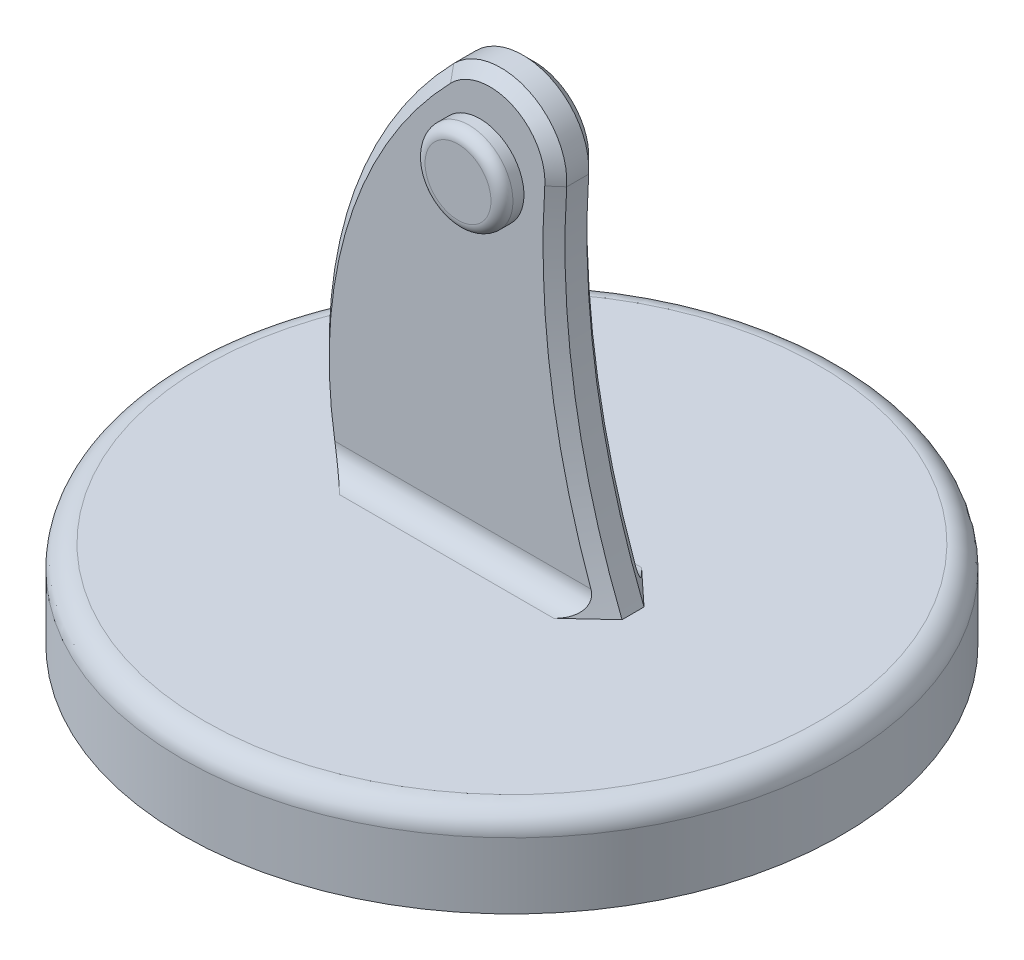
ISO-10303-21;
HEADER;
FILE_DESCRIPTION(('STEP AP214'),'2;1');
FILE_NAME('part.step','',(''),(''),'','','');
FILE_SCHEMA(('AUTOMOTIVE_DESIGN { 1 0 10303 214 1 1 1 1 }'));
ENDSEC;
DATA;
#1=APPLICATION_CONTEXT('core data for automotive mechanical design processes');
#2=APPLICATION_PROTOCOL_DEFINITION('international standard','automotive_design',2000,#1);
#3=PRODUCT_CONTEXT('',#1,'mechanical');
#4=PRODUCT('Part','Part','',(#3));
#5=PRODUCT_RELATED_PRODUCT_CATEGORY('part','',(#4));
#6=PRODUCT_DEFINITION_FORMATION('','',#4);
#7=PRODUCT_DEFINITION_CONTEXT('part definition',#1,'design');
#8=PRODUCT_DEFINITION('design','',#6,#7);
#9=PRODUCT_DEFINITION_SHAPE('','',#8);
#10=(LENGTH_UNIT() NAMED_UNIT(*) SI_UNIT(.MILLI.,.METRE.));
#11=(NAMED_UNIT(*) PLANE_ANGLE_UNIT() SI_UNIT($,.RADIAN.));
#12=(NAMED_UNIT(*) SI_UNIT($,.STERADIAN.) SOLID_ANGLE_UNIT());
#13=UNCERTAINTY_MEASURE_WITH_UNIT(LENGTH_MEASURE(1.E-05),#10,'distance_accuracy_value','');
#14=(GEOMETRIC_REPRESENTATION_CONTEXT(3) GLOBAL_UNCERTAINTY_ASSIGNED_CONTEXT((#13)) GLOBAL_UNIT_ASSIGNED_CONTEXT((#10,
#11,#12)) REPRESENTATION_CONTEXT('',''));
#15=CARTESIAN_POINT('',(0.,0.,0.));
#16=DIRECTION('',(0.,0.,1.));
#17=DIRECTION('',(1.,0.,0.));
#18=AXIS2_PLACEMENT_3D('',#15,#16,#17);
#19=CARTESIAN_POINT('',(0.,20.,0.));
#20=DIRECTION('',(0.,1.,0.));
#21=DIRECTION('',(0.,0.,1.));
#22=AXIS2_PLACEMENT_3D('',#19,#20,#21);
#23=PLANE('',#22);
#24=CARTESIAN_POINT('',(0.,20.,0.));
#25=DIRECTION('',(0.,1.,0.));
#26=DIRECTION('',(0.,0.,1.));
#27=AXIS2_PLACEMENT_3D('',#24,#25,#26);
#28=CIRCLE('',#27,70.);
#29=CARTESIAN_POINT('',(0.,20.,70.));
#30=VERTEX_POINT('',#29);
#31=EDGE_CURVE('E390',#30,#30,#28,.T.);
#32=ORIENTED_EDGE('',*,*,#31,.T.);
#33=EDGE_LOOP('',(#32));
#34=FACE_BOUND('',#33,.T.);
#35=CARTESIAN_POINT('',(-36.9107772179394,20.,-2.50000000000001));
#36=CARTESIAN_POINT('',(-36.0587032409687,20.,-3.33357747056855));
#37=CARTESIAN_POINT('',(-35.2063974116353,20.,-4.16691801838047));
#38=CARTESIAN_POINT('',(-33.5004634846245,20.,-5.83388027654785));
#39=CARTESIAN_POINT('',(-32.6468349025053,20.,-6.66750149112744));
#40=CARTESIAN_POINT('',(-30.9390294844765,20.,-8.33418262843735));
#41=CARTESIAN_POINT('',(-30.0848526484069,20.,-9.16724255100359));
#42=CARTESIAN_POINT('',(-29.2303809474323,20.,-9.9999999999896));
#43=B_SPLINE_CURVE_WITH_KNOTS('',3,(#35,#36,#37,#38,#39,#40,#41,#42),.UNSPECIFIED.,.F.,.F.,(4,2,
2,4),(0.,3.5760220109257,7.15547071970092,10.7349204744513),.UNSPECIFIED.);
#44=CARTESIAN_POINT('',(-36.9107772179394,20.,-2.50000000000001));
#45=VERTEX_POINT('',#44);
#46=CARTESIAN_POINT('',(-29.2303809474323,20.,-10.));
#47=VERTEX_POINT('',#46);
#48=EDGE_CURVE('E203',#45,#47,#43,.T.);
#49=ORIENTED_EDGE('',*,*,#48,.T.);
#50=DIRECTION('',(-1.,0.,0.));
#51=VECTOR('',#50,1.);
#52=CARTESIAN_POINT('',(24.8698524847124,20.,-10.));
#53=LINE('',#52,#51);
#54=CARTESIAN_POINT('',(19.5040463919247,20.,-10.));
#55=VERTEX_POINT('',#54);
#56=EDGE_CURVE('E380',#47,#55,#53,.F.);
#57=ORIENTED_EDGE('',*,*,#56,.T.);
#58=CARTESIAN_POINT('',(19.5040463919247,20.,-10.));
#59=CARTESIAN_POINT('',(20.397508234764,20.,-9.16576602034739));
#60=CARTESIAN_POINT('',(21.2913774927222,20.,-8.33196826222493));
#61=CARTESIAN_POINT('',(23.0799671670029,20.,-6.66528766783262));
#62=CARTESIAN_POINT('',(23.9746875826167,20.,-5.83240483080218));
#63=CARTESIAN_POINT('',(25.766539217704,20.,-4.16618003396809));
#64=CARTESIAN_POINT('',(26.6636719497664,20.,-3.33283970082115));
#65=CARTESIAN_POINT('',(27.56126931161,20.,-2.5));
#66=B_SPLINE_CURVE_WITH_KNOTS('',3,(#58,#59,#60,#61,#62,#63,#64,#65),.UNSPECIFIED.,.F.,.F.,(4,2,
2,4),(0.,3.66714922761795,7.33429540442286,11.0076759368626),.UNSPECIFIED.);
#67=CARTESIAN_POINT('',(27.56126931161,20.,-2.50000000000001));
#68=VERTEX_POINT('',#67);
#69=EDGE_CURVE('E195',#55,#68,#66,.T.);
#70=ORIENTED_EDGE('',*,*,#69,.T.);
#71=DIRECTION('',(0.,0.,-1.));
#72=VECTOR('',#71,1.);
#73=CARTESIAN_POINT('',(27.56126931161,20.,5.));
#74=LINE('',#73,#72);
#75=CARTESIAN_POINT('',(27.56126931161,20.,2.50000000000003));
#76=VERTEX_POINT('',#75);
#77=EDGE_CURVE('E151',#68,#76,#74,.F.);
#78=ORIENTED_EDGE('',*,*,#77,.T.);
#79=CARTESIAN_POINT('',(27.56126931161,20.,2.50000000000003));
#80=CARTESIAN_POINT('',(26.6636719497664,20.,3.33283970082116));
#81=CARTESIAN_POINT('',(25.766539217704,20.,4.16618003396809));
#82=CARTESIAN_POINT('',(23.9746875826167,20.,5.83240483080217));
#83=CARTESIAN_POINT('',(23.0799671670029,20.,6.66528766783261));
#84=CARTESIAN_POINT('',(21.2913774927222,20.,8.33196826222493));
#85=CARTESIAN_POINT('',(20.397508234764,20.,9.16576602034738));
#86=CARTESIAN_POINT('',(19.5040463919247,20.,10.));
#87=B_SPLINE_CURVE_WITH_KNOTS('',3,(#79,#80,#81,#82,#83,#84,#85,#86),.UNSPECIFIED.,.F.,.F.,(4,2,
2,4),(0.,3.6733805324397,7.34052670924461,11.0076759368626),.UNSPECIFIED.);
#88=CARTESIAN_POINT('',(19.5040463919247,20.,10.));
#89=VERTEX_POINT('',#88);
#90=EDGE_CURVE('E162',#76,#89,#87,.T.);
#91=ORIENTED_EDGE('',*,*,#90,.T.);
#92=DIRECTION('',(-1.,0.,0.));
#93=VECTOR('',#92,1.);
#94=CARTESIAN_POINT('',(0.,20.,10.));
#95=LINE('',#94,#93);
#96=CARTESIAN_POINT('',(-29.2303809474216,20.,10.));
#97=VERTEX_POINT('',#96);
#98=EDGE_CURVE('E376',#89,#97,#95,.T.);
#99=ORIENTED_EDGE('',*,*,#98,.T.);
#100=CARTESIAN_POINT('',(-29.2303809474216,20.,9.99999999999999));
#101=CARTESIAN_POINT('',(-30.084852648398,20.,9.16724255101225));
#102=CARTESIAN_POINT('',(-30.9390294844695,20.,8.33418262844429));
#103=CARTESIAN_POINT('',(-32.6468349025017,20.,6.66750149113092));
#104=CARTESIAN_POINT('',(-33.5004634846227,20.,5.83388027654959));
#105=CARTESIAN_POINT('',(-35.2063974116353,20.,4.16691801838047));
#106=CARTESIAN_POINT('',(-36.0587032409687,20.,3.33357747056856));
#107=CARTESIAN_POINT('',(-36.9107772179394,20.,2.50000000000004));
#108=B_SPLINE_CURVE_WITH_KNOTS('',3,(#100,#101,#102,#103,#104,#105,#106,#107),.UNSPECIFIED.,.F.,
.F.,(4,2,2,4),(0.,3.57944975475781,7.15889846354047,10.7349204744661),.UNSPECIFIED.);
#109=CARTESIAN_POINT('',(-36.9107772179394,20.,2.50000000000003));
#110=VERTEX_POINT('',#109);
#111=EDGE_CURVE('E170',#97,#110,#108,.T.);
#112=ORIENTED_EDGE('',*,*,#111,.T.);
#113=DIRECTION('',(0.,0.,-1.));
#114=VECTOR('',#113,1.);
#115=CARTESIAN_POINT('',(-36.9107772179394,20.,5.));
#116=LINE('',#115,#114);
#117=EDGE_CURVE('E143',#110,#45,#116,.T.);
#118=ORIENTED_EDGE('',*,*,#117,.T.);
#119=EDGE_LOOP('',(#49,#57,#70,#78,#91,#99,#112,#118));
#120=FACE_BOUND('',#119,.T.);
#121=ADVANCED_FACE('F39',(#34,#120),#23,.T.);
#122=CARTESIAN_POINT('',(0.,20.,0.));
#123=DIRECTION('',(0.,-1.,0.));
#124=DIRECTION('',(0.,0.,-1.));
#125=AXIS2_PLACEMENT_3D('',#122,#123,#124);
#126=CYLINDRICAL_SURFACE('',#125,75.);
#127=CARTESIAN_POINT('',(0.,15.,0.));
#128=DIRECTION('',(0.,1.,0.));
#129=DIRECTION('',(0.,0.,1.));
#130=AXIS2_PLACEMENT_3D('',#127,#128,#129);
#131=CIRCLE('',#130,75.);
#132=CARTESIAN_POINT('',(0.,15.,75.));
#133=VERTEX_POINT('',#132);
#134=EDGE_CURVE('E325',#133,#133,#131,.F.);
#135=ORIENTED_EDGE('',*,*,#134,.T.);
#136=EDGE_LOOP('',(#135));
#137=FACE_BOUND('',#136,.T.);
#138=CARTESIAN_POINT('',(0.,0.,0.));
#139=DIRECTION('',(0.,1.,0.));
#140=DIRECTION('',(0.,0.,1.));
#141=AXIS2_PLACEMENT_3D('',#138,#139,#140);
#142=CIRCLE('',#141,75.);
#143=CARTESIAN_POINT('',(0.,0.,75.));
#144=VERTEX_POINT('',#143);
#145=EDGE_CURVE('E392',#144,#144,#142,.T.);
#146=ORIENTED_EDGE('',*,*,#145,.T.);
#147=EDGE_LOOP('',(#146));
#148=FACE_BOUND('',#147,.T.);
#149=ADVANCED_FACE('F184',(#137,#148),#126,.T.);
#150=CARTESIAN_POINT('',(0.,0.,0.));
#151=DIRECTION('',(0.,1.,0.));
#152=DIRECTION('',(0.,0.,1.));
#153=AXIS2_PLACEMENT_3D('',#150,#151,#152);
#154=PLANE('',#153);
#155=ORIENTED_EDGE('',*,*,#145,.F.);
#156=EDGE_LOOP('',(#155));
#157=FACE_BOUND('',#156,.T.);
#158=ADVANCED_FACE('F188',(#157),#154,.F.);
#159=CARTESIAN_POINT('',(0.,15.,0.));
#160=DIRECTION('',(0.,1.,0.));
#161=DIRECTION('',(0.,0.,1.));
#162=AXIS2_PLACEMENT_3D('',#159,#160,#161);
#163=TOROIDAL_SURFACE('',#162,70.,5.);
#164=ORIENTED_EDGE('',*,*,#134,.F.);
#165=EDGE_LOOP('',(#164));
#166=FACE_BOUND('',#165,.T.);
#167=ORIENTED_EDGE('',*,*,#31,.F.);
#168=EDGE_LOOP('',(#167));
#169=FACE_BOUND('',#168,.T.);
#170=ADVANCED_FACE('F315',(#166,#169),#163,.T.);
#171=CARTESIAN_POINT('',(60.9187119088552,40.721753236403,5.));
#172=DIRECTION('',(0.,0.,-1.));
#173=DIRECTION('',(-1.,0.,0.));
#174=AXIS2_PLACEMENT_3D('',#171,#172,#173);
#175=CYLINDRICAL_SURFACE('',#174,100.);
#176=DIRECTION('',(0.,0.,-1.));
#177=VECTOR('',#176,1.);
#178=CARTESIAN_POINT('',(-10.7503609250921,110.460867075929,5.));
#179=LINE('',#178,#177);
#180=CARTESIAN_POINT('',(-10.7503609250921,110.460867075929,2.50000000000003));
#181=VERTEX_POINT('',#180);
#182=CARTESIAN_POINT('',(-10.7503609250921,110.460867075929,-2.50000000000001));
#183=VERTEX_POINT('',#182);
#184=EDGE_CURVE('E353',#181,#183,#179,.T.);
#185=ORIENTED_EDGE('',*,*,#184,.T.);
#186=CARTESIAN_POINT('',(60.9187119088552,40.721753236403,-2.50000000000001));
#187=DIRECTION('',(0.,0.,-1.));
#188=DIRECTION('',(-1.,0.,0.));
#189=AXIS2_PLACEMENT_3D('',#186,#187,#188);
#190=CIRCLE('',#189,100.);
#191=EDGE_CURVE('E344',#183,#45,#190,.F.);
#192=ORIENTED_EDGE('',*,*,#191,.T.);
#193=ORIENTED_EDGE('',*,*,#117,.F.);
#194=CARTESIAN_POINT('',(60.9187119088552,40.721753236403,2.50000000000003));
#195=DIRECTION('',(0.,0.,-1.));
#196=DIRECTION('',(-1.,0.,0.));
#197=AXIS2_PLACEMENT_3D('',#194,#195,#196);
#198=CIRCLE('',#197,100.);
#199=EDGE_CURVE('E156',#110,#181,#198,.T.);
#200=ORIENTED_EDGE('',*,*,#199,.T.);
#201=EDGE_LOOP('',(#185,#192,#193,#200));
#202=FACE_BOUND('',#201,.T.);
#203=ADVANCED_FACE('F186',(#202),#175,.T.);
#204=CARTESIAN_POINT('',(194.574841211618,87.1302227107951,5.));
#205=DIRECTION('',(0.,0.,-1.));
#206=DIRECTION('',(-1.,0.,0.));
#207=AXIS2_PLACEMENT_3D('',#204,#205,#206);
#208=CYLINDRICAL_SURFACE('',#207,180.);
#209=ORIENTED_EDGE('',*,*,#77,.F.);
#210=CARTESIAN_POINT('',(194.574841211618,87.1302227107951,-2.50000000000001));
#211=DIRECTION('',(0.,0.,-1.));
#212=DIRECTION('',(-1.,0.,0.));
#213=AXIS2_PLACEMENT_3D('',#210,#211,#212);
#214=CIRCLE('',#213,180.);
#215=CARTESIAN_POINT('',(14.9672954778167,99.0100171315997,-2.50000000000001));
#216=VERTEX_POINT('',#215);
#217=EDGE_CURVE('E321',#68,#216,#214,.T.);
#218=ORIENTED_EDGE('',*,*,#217,.T.);
#219=DIRECTION('',(0.,0.,-1.));
#220=VECTOR('',#219,1.);
#221=CARTESIAN_POINT('',(14.9672954778167,99.0100171315997,5.));
#222=LINE('',#221,#220);
#223=CARTESIAN_POINT('',(14.9672954778167,99.0100171315997,2.50000000000003));
#224=VERTEX_POINT('',#223);
#225=EDGE_CURVE('E354',#224,#216,#222,.T.);
#226=ORIENTED_EDGE('',*,*,#225,.F.);
#227=CARTESIAN_POINT('',(194.574841211618,87.1302227107951,2.50000000000003));
#228=DIRECTION('',(0.,0.,-1.));
#229=DIRECTION('',(-1.,0.,0.));
#230=AXIS2_PLACEMENT_3D('',#227,#228,#229);
#231=CIRCLE('',#230,180.);
#232=EDGE_CURVE('E124',#224,#76,#231,.F.);
#233=ORIENTED_EDGE('',*,*,#232,.T.);
#234=EDGE_LOOP('',(#209,#218,#226,#233));
#235=FACE_BOUND('',#234,.T.);
#236=ADVANCED_FACE('F307',(#235),#208,.F.);
#237=CARTESIAN_POINT('',(0.,100.,5.));
#238=DIRECTION('',(0.,0.,-1.));
#239=DIRECTION('',(-1.,0.,0.));
#240=AXIS2_PLACEMENT_3D('',#237,#238,#239);
#241=CYLINDRICAL_SURFACE('',#240,15.);
#242=ORIENTED_EDGE('',*,*,#225,.T.);
#243=CARTESIAN_POINT('',(0.,100.,-2.50000000000001));
#244=DIRECTION('',(0.,0.,-1.));
#245=DIRECTION('',(-1.,0.,0.));
#246=AXIS2_PLACEMENT_3D('',#243,#244,#245);
#247=CIRCLE('',#246,15.);
#248=EDGE_CURVE('E204',#216,#183,#247,.F.);
#249=ORIENTED_EDGE('',*,*,#248,.T.);
#250=ORIENTED_EDGE('',*,*,#184,.F.);
#251=CARTESIAN_POINT('',(0.,100.,2.50000000000003));
#252=DIRECTION('',(0.,0.,-1.));
#253=DIRECTION('',(-1.,0.,0.));
#254=AXIS2_PLACEMENT_3D('',#251,#252,#253);
#255=CIRCLE('',#254,15.);
#256=EDGE_CURVE('E159',#181,#224,#255,.T.);
#257=ORIENTED_EDGE('',*,*,#256,.T.);
#258=EDGE_LOOP('',(#242,#249,#250,#257));
#259=FACE_BOUND('',#258,.T.);
#260=ADVANCED_FACE('F299',(#259),#241,.T.);
#261=CARTESIAN_POINT('',(60.9187119088552,40.721753236403,5.));
#262=DIRECTION('',(0.,0.,-1.));
#263=DIRECTION('',(-1.,0.,0.));
#264=AXIS2_PLACEMENT_3D('',#261,#262,#263);
#265=PLANE('',#264);
#266=CARTESIAN_POINT('',(-2.26683937823834,95.0647668393783,5.));
#267=DIRECTION('',(0.,0.,-1.));
#268=DIRECTION('',(-1.,0.,0.));
#269=AXIS2_PLACEMENT_3D('',#266,#267,#268);
#270=CIRCLE('',#269,10.);
#271=CARTESIAN_POINT('',(-12.2668393782383,95.0647668393783,5.));
#272=VERTEX_POINT('',#271);
#273=EDGE_CURVE('E268',#272,#272,#270,.F.);
#274=ORIENTED_EDGE('',*,*,#273,.F.);
#275=EDGE_LOOP('',(#274));
#276=FACE_BOUND('',#275,.T.);
#277=CARTESIAN_POINT('',(60.9187119088552,40.721753236403,5.));
#278=DIRECTION('',(0.,0.,-1.));
#279=DIRECTION('',(-1.,0.,0.));
#280=AXIS2_PLACEMENT_3D('',#277,#278,#279);
#281=CIRCLE('',#280,97.5);
#282=CARTESIAN_POINT('',(-8.95863410424345,108.717389229941,5.));
#283=VERTEX_POINT('',#282);
#284=CARTESIAN_POINT('',(-35.3053831774258,25.,5.));
#285=VERTEX_POINT('',#284);
#286=EDGE_CURVE('E125',#283,#285,#281,.F.);
#287=ORIENTED_EDGE('',*,*,#286,.T.);
#288=DIRECTION('',(-1.,0.,0.));
#289=VECTOR('',#288,1.);
#290=CARTESIAN_POINT('',(60.9187119088552,25.,5.));
#291=LINE('',#290,#289);
#292=CARTESIAN_POINT('',(22.9762240088355,25.,5.));
#293=VERTEX_POINT('',#292);
#294=EDGE_CURVE('E62',#285,#293,#291,.F.);
#295=ORIENTED_EDGE('',*,*,#294,.T.);
#296=CARTESIAN_POINT('',(194.574841211618,87.1302227107951,5.));
#297=DIRECTION('',(0.,0.,-1.));
#298=DIRECTION('',(-1.,0.,0.));
#299=AXIS2_PLACEMENT_3D('',#296,#297,#298);
#300=CIRCLE('',#299,182.5);
#301=CARTESIAN_POINT('',(12.472746231514,99.1750142763331,5.));
#302=VERTEX_POINT('',#301);
#303=EDGE_CURVE('E115',#293,#302,#300,.T.);
#304=ORIENTED_EDGE('',*,*,#303,.T.);
#305=CARTESIAN_POINT('',(0.,100.,5.));
#306=DIRECTION('',(0.,0.,-1.));
#307=DIRECTION('',(-1.,0.,0.));
#308=AXIS2_PLACEMENT_3D('',#305,#306,#307);
#309=CIRCLE('',#308,12.5);
#310=EDGE_CURVE('E119',#302,#283,#309,.F.);
#311=ORIENTED_EDGE('',*,*,#310,.T.);
#312=EDGE_LOOP('',(#287,#295,#304,#311));
#313=FACE_BOUND('',#312,.T.);
#314=ADVANCED_FACE('F117',(#276,#313),#265,.F.);
#315=CARTESIAN_POINT('',(60.9187119088552,40.721753236403,-5.));
#316=DIRECTION('',(0.,0.,-1.));
#317=DIRECTION('',(-1.,0.,0.));
#318=AXIS2_PLACEMENT_3D('',#315,#316,#317);
#319=PLANE('',#318);
#320=CARTESIAN_POINT('',(-2.46010728193369,95.7610562814182,-5.));
#321=DIRECTION('',(0.,0.,-1.));
#322=DIRECTION('',(-1.,0.,0.));
#323=AXIS2_PLACEMENT_3D('',#320,#321,#322);
#324=CIRCLE('',#323,5.00000000000001);
#325=CARTESIAN_POINT('',(-7.4601072819337,95.7610562814182,-5.));
#326=VERTEX_POINT('',#325);
#327=EDGE_CURVE('E401',#326,#326,#324,.T.);
#328=ORIENTED_EDGE('',*,*,#327,.F.);
#329=EDGE_LOOP('',(#328));
#330=FACE_BOUND('',#329,.T.);
#331=CARTESIAN_POINT('',(194.574841211618,87.1302227107951,-5.));
#332=DIRECTION('',(0.,0.,-1.));
#333=DIRECTION('',(-1.,0.,0.));
#334=AXIS2_PLACEMENT_3D('',#331,#332,#333);
#335=CIRCLE('',#334,182.5);
#336=CARTESIAN_POINT('',(12.472746231514,99.1750142763331,-5.));
#337=VERTEX_POINT('',#336);
#338=CARTESIAN_POINT('',(22.9762240088354,25.,-5.));
#339=VERTEX_POINT('',#338);
#340=EDGE_CURVE('E342',#337,#339,#335,.F.);
#341=ORIENTED_EDGE('',*,*,#340,.T.);
#342=DIRECTION('',(-1.,0.,0.));
#343=VECTOR('',#342,1.);
#344=CARTESIAN_POINT('',(-34.3538389272047,25.,-5.));
#345=LINE('',#344,#343);
#346=CARTESIAN_POINT('',(-35.3053831774258,25.,-5.));
#347=VERTEX_POINT('',#346);
#348=EDGE_CURVE('E372',#339,#347,#345,.T.);
#349=ORIENTED_EDGE('',*,*,#348,.T.);
#350=CARTESIAN_POINT('',(60.9187119088552,40.721753236403,-5.));
#351=DIRECTION('',(0.,0.,-1.));
#352=DIRECTION('',(-1.,0.,0.));
#353=AXIS2_PLACEMENT_3D('',#350,#351,#352);
#354=CIRCLE('',#353,97.5);
#355=CARTESIAN_POINT('',(-8.95863410424344,108.717389229941,-5.));
#356=VERTEX_POINT('',#355);
#357=EDGE_CURVE('E335',#347,#356,#354,.T.);
#358=ORIENTED_EDGE('',*,*,#357,.T.);
#359=CARTESIAN_POINT('',(0.,100.,-5.));
#360=DIRECTION('',(0.,0.,-1.));
#361=DIRECTION('',(-1.,0.,0.));
#362=AXIS2_PLACEMENT_3D('',#359,#360,#361);
#363=CIRCLE('',#362,12.5);
#364=EDGE_CURVE('E332',#356,#337,#363,.T.);
#365=ORIENTED_EDGE('',*,*,#364,.T.);
#366=EDGE_LOOP('',(#341,#349,#358,#365));
#367=FACE_BOUND('',#366,.T.);
#368=ADVANCED_FACE('F298',(#330,#367),#319,.T.);
#369=CARTESIAN_POINT('',(60.9187119088552,40.721753236403,5.));
#370=DIRECTION('',(0.,0.,-1.));
#371=DIRECTION('',(-1.,0.,0.));
#372=AXIS2_PLACEMENT_3D('',#369,#370,#371);
#373=CONICAL_SURFACE('',#372,97.5,0.78539816339745);
#374=ORIENTED_EDGE('',*,*,#111,.F.);
#375=CARTESIAN_POINT('',(-29.2303809474216,20.,10.));
#376=CARTESIAN_POINT('',(-29.3347028793489,20.0000053636027,9.89833024255271));
#377=CARTESIAN_POINT('',(-29.4393513812406,20.0031007546724,9.79702641193306));
#378=CARTESIAN_POINT('',(-29.6491194386519,20.0153802698146,9.5952903316681));
#379=CARTESIAN_POINT('',(-29.7542389669116,20.0245640459391,9.4948580325475));
#380=CARTESIAN_POINT('',(-30.0701377622383,20.0611218012653,9.1949763103892));
#381=CARTESIAN_POINT('',(-30.2813689328482,20.0975020512556,8.99702806140294));
#382=CARTESIAN_POINT('',(-30.7052281459129,20.1943228468096,8.6047768763038));
#383=CARTESIAN_POINT('',(-30.917851966101,20.2549738802015,8.41052182829382));
#384=CARTESIAN_POINT('',(-31.3409546343032,20.4003898800269,8.0288920463304));
#385=CARTESIAN_POINT('',(-31.551434202958,20.4851464481943,7.8415149417559));
#386=CARTESIAN_POINT('',(-31.9203100232253,20.6568786080922,7.51751869713425));
#387=CARTESIAN_POINT('',(-32.0795252641407,20.7388364698582,7.37915792008861));
#388=CARTESIAN_POINT('',(-32.3945755277572,20.9177159511093,7.10841226211772));
#389=CARTESIAN_POINT('',(-32.5504112547971,21.0146344177358,6.97602612965126));
#390=CARTESIAN_POINT('',(-32.8570845821133,21.2236918954138,6.71870450307225));
#391=CARTESIAN_POINT('',(-33.007934996199,21.3357873731107,6.59374911870334));
#392=CARTESIAN_POINT('',(-33.3034979686817,21.575983485221,6.35238615047154));
#393=CARTESIAN_POINT('',(-33.4482129461306,21.7040777316098,6.23597518426419));
#394=CARTESIAN_POINT('',(-33.780194683718,22.026016240916,5.97349931996685));
#395=CARTESIAN_POINT('',(-33.9641238094472,22.2269717564346,5.83175904352913));
#396=CARTESIAN_POINT('',(-34.3105833137177,22.6611973901455,5.57352249137931));
#397=CARTESIAN_POINT('',(-34.473133992663,22.8944364143595,5.45700219853487));
#398=CARTESIAN_POINT('',(-34.7319785348576,23.3328146527146,5.28175375317222));
#399=CARTESIAN_POINT('',(-34.834794201295,23.5311445673645,5.21586466175033));
#400=CARTESIAN_POINT('',(-34.9716572697346,23.8406314653159,5.13510303200421));
#401=CARTESIAN_POINT('',(-35.0143521062476,23.9456855394193,5.11120882871324));
#402=CARTESIAN_POINT('',(-35.0933319620212,24.1594047715891,5.06996653280058));
#403=CARTESIAN_POINT('',(-35.1296200264303,24.2680681847923,5.05261532580432));
#404=CARTESIAN_POINT('',(-35.1925156148146,24.4796845314224,5.02609666208076));
#405=CARTESIAN_POINT('',(-35.2196618228114,24.5824092751453,5.01639043281165));
#406=CARTESIAN_POINT('',(-35.2675009884257,24.7898821524955,5.00332990734187));
#407=CARTESIAN_POINT('',(-35.288185543167,24.8946327342463,4.99998385355531));
#408=CARTESIAN_POINT('',(-35.3053831774258,25.,5.));
#409=B_SPLINE_CURVE_WITH_KNOTS('',3,(#375,#376,#377,#378,#379,#380,#381,#382,#383,#384,#385,
#386,#387,#388,#389,#390,#391,#392,#393,#394,#395,#396,#397,#398,#399,#400,#401,#402,#403,#404,
#405,#406,#407,#408),.UNSPECIFIED.,.F.,.F.,(4,2,2,2,2,2,2,2,2,2,2,2,2,2,2,2,4),(0.,
0.436936358714164,0.873847748900103,1.74803914560094,2.62998220413127,3.5116183730414,
4.18997106852509,4.86818099989577,5.54448523247615,6.22052028690257,7.1388404861602,
8.05628227821603,8.75224458867896,9.09955760308936,9.44670509207111,9.76639314440075,
10.0864952119684),.UNSPECIFIED.);
#410=EDGE_CURVE('E55',#97,#285,#409,.T.);
#411=ORIENTED_EDGE('',*,*,#410,.T.);
#412=ORIENTED_EDGE('',*,*,#286,.F.);
#413=DIRECTION('',(0.506776874022369,-0.493130003098695,0.707106781186545));
#414=VECTOR('',#413,1.);
#415=CARTESIAN_POINT('',(-10.7503609250921,110.460867075929,2.50000000000003));
#416=LINE('',#415,#414);
#417=EDGE_CURVE('E136',#181,#283,#416,.T.);
#418=ORIENTED_EDGE('',*,*,#417,.F.);
#419=ORIENTED_EDGE('',*,*,#199,.F.);
#420=EDGE_LOOP('',(#374,#411,#412,#418,#419));
#421=FACE_BOUND('',#420,.T.);
#422=ADVANCED_FACE('F224',(#421),#373,.T.);
#423=CARTESIAN_POINT('',(0.,100.,5.));
#424=DIRECTION('',(0.,0.,-1.));
#425=DIRECTION('',(-1.,0.,0.));
#426=AXIS2_PLACEMENT_3D('',#423,#424,#425);
#427=CONICAL_SURFACE('',#426,12.5,0.785398163397449);
#428=ORIENTED_EDGE('',*,*,#417,.T.);
#429=ORIENTED_EDGE('',*,*,#310,.F.);
#430=DIRECTION('',(-0.705565075225798,0.0466682399669605,0.707106781186547));
#431=VECTOR('',#430,1.);
#432=CARTESIAN_POINT('',(14.9672954778168,99.0100171315997,2.50000000000003));
#433=LINE('',#432,#431);
#434=EDGE_CURVE('E129',#224,#302,#433,.T.);
#435=ORIENTED_EDGE('',*,*,#434,.F.);
#436=ORIENTED_EDGE('',*,*,#256,.F.);
#437=EDGE_LOOP('',(#428,#429,#435,#436));
#438=FACE_BOUND('',#437,.T.);
#439=ADVANCED_FACE('F140',(#438),#427,.T.);
#440=CARTESIAN_POINT('',(194.574841211618,87.1302227107951,5.));
#441=DIRECTION('',(0.,0.,1.));
#442=DIRECTION('',(1.,0.,0.));
#443=AXIS2_PLACEMENT_3D('',#440,#441,#442);
#444=CONICAL_SURFACE('',#443,182.5,0.78539816339745);
#445=ORIENTED_EDGE('',*,*,#90,.F.);
#446=ORIENTED_EDGE('',*,*,#232,.F.);
#447=ORIENTED_EDGE('',*,*,#434,.T.);
#448=ORIENTED_EDGE('',*,*,#303,.F.);
#449=CARTESIAN_POINT('',(22.9762240088355,25.,5.));
#450=CARTESIAN_POINT('',(23.0099370470885,24.9069157017624,4.9999895892732));
#451=CARTESIAN_POINT('',(23.0412742653654,24.8129379999385,5.00259927330863));
#452=CARTESIAN_POINT('',(23.0987854489816,24.6236542331049,5.01328475891735));
#453=CARTESIAN_POINT('',(23.1249557605201,24.5283472787374,5.02136441084718));
#454=CARTESIAN_POINT('',(23.1717019901087,24.3368764942147,5.04323006444154));
#455=CARTESIAN_POINT('',(23.1922708728319,24.2407117417242,5.05702318786934));
#456=CARTESIAN_POINT('',(23.2273894805785,24.0483131902262,5.09043580391505));
#457=CARTESIAN_POINT('',(23.2419406671769,23.9520794136781,5.11005387978051));
#458=CARTESIAN_POINT('',(23.2647833166179,23.7598203344475,5.1552351637102));
#459=CARTESIAN_POINT('',(23.2730477896944,23.6637976758326,5.18082339566354));
#460=CARTESIAN_POINT('',(23.2830282430036,23.4731042230749,5.23780565523052));
#461=CARTESIAN_POINT('',(23.2847418832981,23.3784339240182,5.2692017531996));
#462=CARTESIAN_POINT('',(23.2815619245217,23.1914300134894,5.33749389565747));
#463=CARTESIAN_POINT('',(23.2766817102653,23.0990920548276,5.37437866362523));
#464=CARTESIAN_POINT('',(23.260417547921,22.9172261879955,5.45336536198341));
#465=CARTESIAN_POINT('',(23.2490311407493,22.8276993558246,5.49546926028435));
#466=CARTESIAN_POINT('',(23.2206623799136,22.6563299969838,5.58230951956346));
#467=CARTESIAN_POINT('',(23.2039750671677,22.5743249209314,5.62682231415856));
#468=CARTESIAN_POINT('',(23.1651713088466,22.4138726555133,5.71974851154784));
#469=CARTESIAN_POINT('',(23.1430530890256,22.3354266388145,5.76816318558406));
#470=CARTESIAN_POINT('',(23.0690156347531,22.105877529034,5.91864099625142));
#471=CARTESIAN_POINT('',(23.0094188044589,21.9605937072141,6.02592237199906));
#472=CARTESIAN_POINT('',(22.8473904205651,21.6361880505762,6.29272426139297));
#473=CARTESIAN_POINT('',(22.7372738684435,21.4646897459645,6.45679211363705));
#474=CARTESIAN_POINT('',(22.4923618332375,21.1540653408924,6.79656248299615));
#475=CARTESIAN_POINT('',(22.3575250097188,21.014994368163,6.97228417018861));
#476=CARTESIAN_POINT('',(22.0080463865821,20.7139350239191,7.4064982906126));
#477=CARTESIAN_POINT('',(21.7839426038634,20.5675989973568,7.66823746391429));
#478=CARTESIAN_POINT('',(21.4302352250688,20.3882622477069,8.06277646473099));
#479=CARTESIAN_POINT('',(21.3091591969956,20.3351149891571,8.19486546063225));
#480=CARTESIAN_POINT('',(21.0622024437239,20.2413193614823,8.45903076647484));
#481=CARTESIAN_POINT('',(20.9363227196791,20.2006684037835,8.59110707337021));
#482=CARTESIAN_POINT('',(20.7034205871166,20.1372247368925,8.83124426659851));
#483=CARTESIAN_POINT('',(20.5970089108958,20.1125440271642,8.93941382435171));
#484=CARTESIAN_POINT('',(20.3820365397486,20.0706845431201,9.15506821537181));
#485=CARTESIAN_POINT('',(20.2734758616956,20.0535057099265,9.26255305400616));
#486=CARTESIAN_POINT('',(20.0555501386693,20.0264170739506,9.47567485776333));
#487=CARTESIAN_POINT('',(19.9462004855637,20.0164448742991,9.58131976193184));
#488=CARTESIAN_POINT('',(19.7261023837508,20.0032412410283,9.79151616365991));
#489=CARTESIAN_POINT('',(19.6153542941703,20.0000081108226,9.8960679298246));
#490=CARTESIAN_POINT('',(19.5040463919247,20.,10.));
#491=B_SPLINE_CURVE_WITH_KNOTS('',3,(#449,#450,#451,#452,#453,#454,#455,#456,#457,#458,#459,
#460,#461,#462,#463,#464,#465,#466,#467,#468,#469,#470,#471,#472,#473,#474,#475,#476,#477,#478,
#479,#480,#481,#482,#483,#484,#485,#486,#487,#488,#489,#490),.UNSPECIFIED.,.F.,.F.,(4,2,2,2,2,2,
2,2,2,2,2,2,2,2,2,2,2,2,2,2,4),(0.,0.296983134573583,0.594175535736814,0.891739503216549,
1.18923115600604,1.48799288544807,1.78686132174319,2.08512399785115,2.38349948009408,
2.66754396460351,2.95168136855396,3.52005845309203,4.30068334048906,5.08262579933337,
6.19912096011023,6.75951456649571,7.319792010568,7.78079600593912,8.24179638308888,
8.69875585472501,9.15560027118645),.UNSPECIFIED.);
#492=EDGE_CURVE('E261',#293,#89,#491,.T.);
#493=ORIENTED_EDGE('',*,*,#492,.T.);
#494=EDGE_LOOP('',(#445,#446,#447,#448,#493));
#495=FACE_BOUND('',#494,.T.);
#496=ADVANCED_FACE('F131',(#495),#444,.F.);
#497=CARTESIAN_POINT('',(60.9187119088552,40.721753236403,-2.50000000000001));
#498=DIRECTION('',(0.,0.,1.));
#499=DIRECTION('',(1.,0.,0.));
#500=AXIS2_PLACEMENT_3D('',#497,#498,#499);
#501=CONICAL_SURFACE('',#500,100.,0.78539816339745);
#502=ORIENTED_EDGE('',*,*,#48,.F.);
#503=ORIENTED_EDGE('',*,*,#191,.F.);
#504=DIRECTION('',(-0.506776874022368,0.493130003098695,0.707106781186547));
#505=VECTOR('',#504,1.);
#506=CARTESIAN_POINT('',(-8.95863410424344,108.717389229941,-5.));
#507=LINE('',#506,#505);
#508=EDGE_CURVE('E137',#356,#183,#507,.T.);
#509=ORIENTED_EDGE('',*,*,#508,.F.);
#510=ORIENTED_EDGE('',*,*,#357,.F.);
#511=CARTESIAN_POINT('',(-35.3053831774258,25.,-5.));
#512=CARTESIAN_POINT('',(-35.2855001699583,24.8781145463466,-4.99997178976478));
#513=CARTESIAN_POINT('',(-35.26094003481,24.7570716121715,-5.004455118083));
#514=CARTESIAN_POINT('',(-35.2032696041432,24.5178585989152,-5.02186581657455));
#515=CARTESIAN_POINT('',(-35.1701734005203,24.3996841328831,-5.03477932295659));
#516=CARTESIAN_POINT('',(-35.0965653161442,24.1682490553543,-5.06829258154955));
#517=CARTESIAN_POINT('',(-35.056137595265,24.0549490971313,-5.08880761014345));
#518=CARTESIAN_POINT('',(-34.9684486172846,23.8325541200287,-5.13687106557854));
#519=CARTESIAN_POINT('',(-34.9211846652572,23.7234607810325,-5.16442226946146));
#520=CARTESIAN_POINT('',(-34.7710384686172,23.4047088566528,-5.25619679613961));
#521=CARTESIAN_POINT('',(-34.6592365705353,23.2018620621736,-5.32980767508141));
#522=CARTESIAN_POINT('',(-34.4172820280106,22.8159346199051,-5.49729431505917));
#523=CARTESIAN_POINT('',(-34.2870712408256,22.6329199763908,-5.59123480438223));
#524=CARTESIAN_POINT('',(-34.0389032791936,22.3198228456305,-5.77588437258467));
#525=CARTESIAN_POINT('',(-33.9232520826425,22.1862608272254,-5.86387417920257));
#526=CARTESIAN_POINT('',(-33.684828940672,21.9321422870963,-6.04867763946725));
#527=CARTESIAN_POINT('',(-33.5620535330038,21.8115921717265,-6.14549559673201));
#528=CARTESIAN_POINT('',(-33.3107221547247,21.5829206219314,-6.34667256956864));
#529=CARTESIAN_POINT('',(-33.1821559545587,21.4748224861256,-6.45104514501917));
#530=CARTESIAN_POINT('',(-32.9206754566209,21.2708559600913,-6.66601806936328));
#531=CARTESIAN_POINT('',(-32.7877613697381,21.1749869778044,-6.77661811638809));
#532=CARTESIAN_POINT('',(-32.4675969780412,20.9609806143577,-7.046003992053));
#533=CARTESIAN_POINT('',(-32.2788130973539,20.8481393870248,-7.20719015267989));
#534=CARTESIAN_POINT('',(-31.8968160594673,20.6439369795829,-7.53778982306182));
#535=CARTESIAN_POINT('',(-31.7036009453651,20.5525854982618,-7.70720700619739));
#536=CARTESIAN_POINT('',(-31.3145309920635,20.3908592767417,-8.05265060572822));
#537=CARTESIAN_POINT('',(-31.11867748519,20.3204743354812,-8.22867376095856));
#538=CARTESIAN_POINT('',(-30.7257337743357,20.2003740631592,-8.58609705995558));
#539=CARTESIAN_POINT('',(-30.5286441471239,20.15064972858,-8.76749482456622));
#540=CARTESIAN_POINT('',(-30.1470567716326,20.0743957236696,-9.12290573703233));
#541=CARTESIAN_POINT('',(-29.9625624321786,20.0465825963957,-9.2966459779807));
#542=CARTESIAN_POINT('',(-29.6868882100713,20.0186932330006,-9.5592091287768));
#543=CARTESIAN_POINT('',(-29.5953094087704,20.0117020057929,-9.64692441463581));
#544=CARTESIAN_POINT('',(-29.4125305511942,20.0023568281948,-9.82300103551236));
#545=CARTESIAN_POINT('',(-29.321330510161,20.0000030626541,-9.91136239614161));
#546=CARTESIAN_POINT('',(-29.2303809474272,20.,-9.99999999999455));
#547=B_SPLINE_CURVE_WITH_KNOTS('',3,(#511,#512,#513,#514,#515,#516,#517,#518,#519,#520,#521,
#522,#523,#524,#525,#526,#527,#528,#529,#530,#531,#532,#533,#534,#535,#536,#537,#538,#539,#540,
#541,#542,#543,#544,#545,#546),.UNSPECIFIED.,.F.,.F.,(4,2,2,2,2,2,2,2,2,2,2,2,2,2,2,2,2,4),(0.,
0.370201731475449,0.739796178744562,1.10538945093652,1.47112723929015,2.19719181402528,
2.92560307035649,3.51692454026524,4.10853582938211,4.70123668113959,5.29390882716738,
6.11079348846447,6.92804612320218,7.74490047990389,8.56139849200052,9.3255110703521,
9.70644168325098,10.087387479774),.UNSPECIFIED.);
#548=EDGE_CURVE('E237',#347,#47,#547,.T.);
#549=ORIENTED_EDGE('',*,*,#548,.T.);
#550=EDGE_LOOP('',(#502,#503,#509,#510,#549));
#551=FACE_BOUND('',#550,.T.);
#552=ADVANCED_FACE('F253',(#551),#501,.T.);
#553=CARTESIAN_POINT('',(0.,100.,-2.50000000000001));
#554=DIRECTION('',(0.,0.,1.));
#555=DIRECTION('',(1.,0.,0.));
#556=AXIS2_PLACEMENT_3D('',#553,#554,#555);
#557=CONICAL_SURFACE('',#556,15.,0.785398163397448);
#558=ORIENTED_EDGE('',*,*,#508,.T.);
#559=ORIENTED_EDGE('',*,*,#248,.F.);
#560=DIRECTION('',(0.705565075225798,-0.04666823996696,0.707106781186548));
#561=VECTOR('',#560,1.);
#562=CARTESIAN_POINT('',(12.472746231514,99.1750142763331,-5.));
#563=LINE('',#562,#561);
#564=EDGE_CURVE('E329',#337,#216,#563,.T.);
#565=ORIENTED_EDGE('',*,*,#564,.F.);
#566=ORIENTED_EDGE('',*,*,#364,.F.);
#567=EDGE_LOOP('',(#558,#559,#565,#566));
#568=FACE_BOUND('',#567,.T.);
#569=ADVANCED_FACE('F221',(#568),#557,.T.);
#570=CARTESIAN_POINT('',(194.574841211618,87.1302227107951,-2.50000000000001));
#571=DIRECTION('',(0.,0.,-1.));
#572=DIRECTION('',(-1.,0.,0.));
#573=AXIS2_PLACEMENT_3D('',#570,#571,#572);
#574=CONICAL_SURFACE('',#573,180.,0.78539816339745);
#575=ORIENTED_EDGE('',*,*,#69,.F.);
#576=CARTESIAN_POINT('',(19.5040463919247,20.,-10.));
#577=CARTESIAN_POINT('',(19.6571568075096,20.0000296929262,-9.85702941087031));
#578=CARTESIAN_POINT('',(19.8092332164888,20.0061351146358,-9.71287130028519));
#579=CARTESIAN_POINT('',(20.110681050572,20.0313180100448,-9.42245532239644));
#580=CARTESIAN_POINT('',(20.2600483189607,20.0504139288742,-9.27619475927547));
#581=CARTESIAN_POINT('',(20.5566144894932,20.1026874432451,-8.98065016409485));
#582=CARTESIAN_POINT('',(20.7037717645803,20.1360168780228,-8.83135056120005));
#583=CARTESIAN_POINT('',(20.9929521049665,20.2178121624605,-8.53210134872879));
#584=CARTESIAN_POINT('',(21.1349781188848,20.2662691597734,-8.38215216974714));
#585=CARTESIAN_POINT('',(21.4783373395133,20.4063996642475,-8.01136901743156));
#586=CARTESIAN_POINT('',(21.6759391840302,20.5076730533831,-7.79056238983466));
#587=CARTESIAN_POINT('',(22.0502844216893,20.7501542870256,-7.35408814437467));
#588=CARTESIAN_POINT('',(22.2270964608841,20.8912251595262,-7.13840560424179));
#589=CARTESIAN_POINT('',(22.5157955889418,21.1822211240286,-6.76461619754136));
#590=CARTESIAN_POINT('',(22.633423743593,21.3234558593961,-6.6042369808728));
#591=CARTESIAN_POINT('',(22.844834627395,21.6345823955415,-6.29570843628869));
#592=CARTESIAN_POINT('',(22.9386389276315,21.8044480391717,-6.14754812756608));
#593=CARTESIAN_POINT('',(23.0815627306453,22.1387505319177,-5.89526228235166));
#594=CARTESIAN_POINT('',(23.1356849834168,22.298667311498,-5.78800981490899));
#595=CARTESIAN_POINT('',(23.2199113483762,22.6345278371791,-5.59065102960996));
#596=CARTESIAN_POINT('',(23.2500437640378,22.8104524230911,-5.50052460217033));
#597=CARTESIAN_POINT('',(23.284185406208,23.1745224148646,-5.34089618217095));
#598=CARTESIAN_POINT('',(23.2881143561399,23.3627035934916,-5.27145819054985));
#599=CARTESIAN_POINT('',(23.2694351916237,23.7450810021075,-5.15591990601121));
#600=CARTESIAN_POINT('',(23.2467921519347,23.9392848210989,-5.10985044191645));
#601=CARTESIAN_POINT('',(23.1855255183862,24.2795945532126,-5.04993138890983));
#602=CARTESIAN_POINT('',(23.1521882132494,24.4258066471385,-5.03094901958075));
#603=CARTESIAN_POINT('',(23.0928473694777,24.6430647105427,-5.01222846382495));
#604=CARTESIAN_POINT('',(23.0715503391316,24.7150338620774,-5.0076134283875));
#605=CARTESIAN_POINT('',(23.0260331846648,24.8581654080353,-5.00149866630109));
#606=CARTESIAN_POINT('',(23.0018135053938,24.9293279234356,-4.99999846618152));
#607=CARTESIAN_POINT('',(22.9762240088354,25.,-4.99999999999999));
#608=B_SPLINE_CURVE_WITH_KNOTS('',3,(#576,#577,#578,#579,#580,#581,#582,#583,#584,#585,#586,
#587,#588,#589,#590,#591,#592,#593,#594,#595,#596,#597,#598,#599,#600,#601,#602,#603,#604,#605,
#606,#607),.UNSPECIFIED.,.F.,.F.,(4,2,2,2,2,2,2,2,2,2,2,2,2,2,2,4),(0.,0.62843696618091,
1.25776811390504,1.89398742195794,2.52983512285981,3.46650931525375,4.39999825883458,
5.12924636182968,5.85783180086147,6.45535549674977,7.05217317857046,7.65081842626506,
8.25025139323398,8.70255982421886,8.92803583803966,9.15347757586476),.UNSPECIFIED.);
#609=EDGE_CURVE('E228',#55,#339,#608,.T.);
#610=ORIENTED_EDGE('',*,*,#609,.T.);
#611=ORIENTED_EDGE('',*,*,#340,.F.);
#612=ORIENTED_EDGE('',*,*,#564,.T.);
#613=ORIENTED_EDGE('',*,*,#217,.F.);
#614=EDGE_LOOP('',(#575,#610,#611,#612,#613));
#615=FACE_BOUND('',#614,.T.);
#616=ADVANCED_FACE('F213',(#615),#574,.F.);
#617=CARTESIAN_POINT('',(60.9187119088552,25.,-10.));
#618=DIRECTION('',(1.,0.,0.));
#619=DIRECTION('',(0.,0.,-1.));
#620=AXIS2_PLACEMENT_3D('',#617,#618,#619);
#621=CYLINDRICAL_SURFACE('',#620,5.);
#622=ORIENTED_EDGE('',*,*,#609,.F.);
#623=ORIENTED_EDGE('',*,*,#56,.F.);
#624=ORIENTED_EDGE('',*,*,#548,.F.);
#625=ORIENTED_EDGE('',*,*,#348,.F.);
#626=EDGE_LOOP('',(#622,#623,#624,#625));
#627=FACE_BOUND('',#626,.T.);
#628=ADVANCED_FACE('F220',(#627),#621,.F.);
#629=CARTESIAN_POINT('',(0.,25.,10.));
#630=DIRECTION('',(-1.,0.,0.));
#631=DIRECTION('',(0.,0.,1.));
#632=AXIS2_PLACEMENT_3D('',#629,#630,#631);
#633=CYLINDRICAL_SURFACE('',#632,5.);
#634=ORIENTED_EDGE('',*,*,#492,.F.);
#635=ORIENTED_EDGE('',*,*,#294,.F.);
#636=ORIENTED_EDGE('',*,*,#410,.F.);
#637=ORIENTED_EDGE('',*,*,#98,.F.);
#638=EDGE_LOOP('',(#634,#635,#636,#637));
#639=FACE_BOUND('',#638,.T.);
#640=ADVANCED_FACE('F250',(#639),#633,.F.);
#641=CARTESIAN_POINT('',(-2.26683937823834,95.0647668393783,10.));
#642=DIRECTION('',(0.,0.,-1.));
#643=DIRECTION('',(-1.,0.,0.));
#644=AXIS2_PLACEMENT_3D('',#641,#642,#643);
#645=CYLINDRICAL_SURFACE('',#644,10.);
#646=CARTESIAN_POINT('',(-2.26683937823834,95.0647668393783,7.5));
#647=DIRECTION('',(0.,0.,1.));
#648=DIRECTION('',(1.,0.,0.));
#649=AXIS2_PLACEMENT_3D('',#646,#647,#648);
#650=CIRCLE('',#649,10.);
#651=CARTESIAN_POINT('',(7.73316062176166,95.0647668393783,7.5));
#652=VERTEX_POINT('',#651);
#653=EDGE_CURVE('E11',#652,#652,#650,.F.);
#654=ORIENTED_EDGE('',*,*,#653,.T.);
#655=EDGE_LOOP('',(#654));
#656=FACE_BOUND('',#655,.T.);
#657=ORIENTED_EDGE('',*,*,#273,.T.);
#658=EDGE_LOOP('',(#657));
#659=FACE_BOUND('',#658,.T.);
#660=ADVANCED_FACE('F258',(#656,#659),#645,.T.);
#661=CARTESIAN_POINT('',(-2.26683937823834,95.0647668393783,10.));
#662=DIRECTION('',(0.,0.,1.));
#663=DIRECTION('',(1.,0.,0.));
#664=AXIS2_PLACEMENT_3D('',#661,#662,#663);
#665=PLANE('',#664);
#666=CARTESIAN_POINT('',(-2.26683937823834,95.0647668393783,10.));
#667=DIRECTION('',(0.,0.,1.));
#668=DIRECTION('',(1.,0.,0.));
#669=AXIS2_PLACEMENT_3D('',#666,#667,#668);
#670=CIRCLE('',#669,7.5);
#671=CARTESIAN_POINT('',(5.23316062176166,95.0647668393783,10.));
#672=VERTEX_POINT('',#671);
#673=EDGE_CURVE('E48',#672,#672,#670,.T.);
#674=ORIENTED_EDGE('',*,*,#673,.T.);
#675=EDGE_LOOP('',(#674));
#676=FACE_BOUND('',#675,.T.);
#677=ADVANCED_FACE('F277',(#676),#665,.T.);
#678=CARTESIAN_POINT('',(-2.26683937823834,95.0647668393783,7.5));
#679=DIRECTION('',(0.,0.,1.));
#680=DIRECTION('',(1.,0.,0.));
#681=AXIS2_PLACEMENT_3D('',#678,#679,#680);
#682=TOROIDAL_SURFACE('',#681,7.5,2.5);
#683=ORIENTED_EDGE('',*,*,#653,.F.);
#684=EDGE_LOOP('',(#683));
#685=FACE_BOUND('',#684,.T.);
#686=ORIENTED_EDGE('',*,*,#673,.F.);
#687=EDGE_LOOP('',(#686));
#688=FACE_BOUND('',#687,.T.);
#689=ADVANCED_FACE('F41',(#685,#688),#682,.T.);
#690=CARTESIAN_POINT('',(-2.46010728193369,95.7610562814182,5.));
#691=DIRECTION('',(0.,0.,-1.));
#692=DIRECTION('',(-1.,0.,0.));
#693=AXIS2_PLACEMENT_3D('',#690,#691,#692);
#694=CYLINDRICAL_SURFACE('',#693,5.00000000000001);
#695=CARTESIAN_POINT('',(-2.46010728193369,95.7610562814182,5.));
#696=DIRECTION('',(0.,0.,-1.));
#697=DIRECTION('',(-1.,0.,0.));
#698=AXIS2_PLACEMENT_3D('',#695,#696,#697);
#699=CIRCLE('',#698,5.00000000000001);
#700=CARTESIAN_POINT('',(-7.4601072819337,95.7610562814182,5.));
#701=VERTEX_POINT('',#700);
#702=EDGE_CURVE('E370',#701,#701,#699,.T.);
#703=ORIENTED_EDGE('',*,*,#702,.F.);
#704=EDGE_LOOP('',(#703));
#705=FACE_BOUND('',#704,.T.);
#706=ORIENTED_EDGE('',*,*,#327,.T.);
#707=EDGE_LOOP('',(#706));
#708=FACE_BOUND('',#707,.T.);
#709=ADVANCED_FACE('F280',(#705,#708),#694,.F.);
#710=CARTESIAN_POINT('',(-2.46010728193369,95.7610562814182,5.));
#711=DIRECTION('',(0.,0.,-1.));
#712=DIRECTION('',(-1.,0.,0.));
#713=AXIS2_PLACEMENT_3D('',#710,#711,#712);
#714=PLANE('',#713);
#715=ORIENTED_EDGE('',*,*,#702,.T.);
#716=EDGE_LOOP('',(#715));
#717=FACE_BOUND('',#716,.T.);
#718=ADVANCED_FACE('F286',(#717),#714,.T.);
#719=CLOSED_SHELL('',(#121,#149,#158,#170,#203,#236,#260,#314,#368,#422,#439,#496,#552,#569,
#616,#628,#640,#660,#677,#689,#709,#718));
#720=MANIFOLD_SOLID_BREP('B2',#719);
#721=ADVANCED_BREP_SHAPE_REPRESENTATION('',(#18,#720),#14);
#722=SHAPE_DEFINITION_REPRESENTATION(#9,#721);
ENDSEC;
END-ISO-10303-21;
